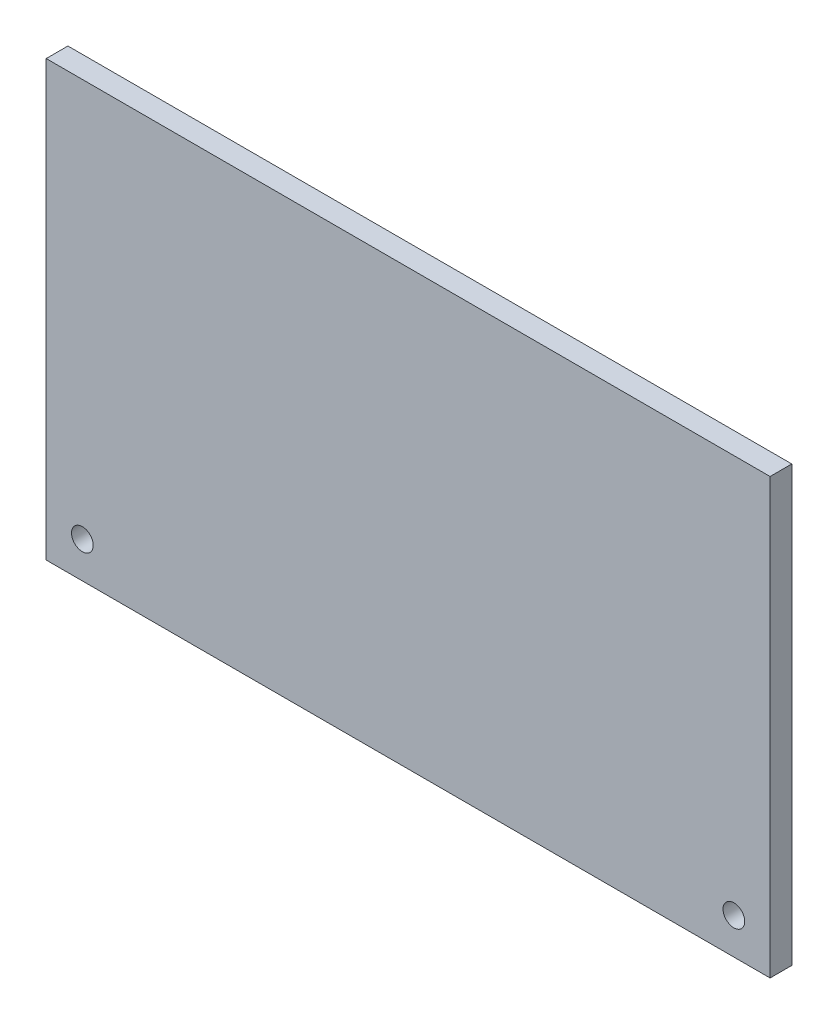
ISO-10303-21;
HEADER;
FILE_DESCRIPTION(('STEP AP214'),'2;1');
FILE_NAME('part.step','',(''),(''),'','','');
FILE_SCHEMA(('AUTOMOTIVE_DESIGN { 1 0 10303 214 1 1 1 1 }'));
ENDSEC;
DATA;
#1=APPLICATION_CONTEXT('core data for automotive mechanical design processes');
#2=APPLICATION_PROTOCOL_DEFINITION('international standard','automotive_design',2000,#1);
#3=PRODUCT_CONTEXT('',#1,'mechanical');
#4=PRODUCT('Part','Part','',(#3));
#5=PRODUCT_RELATED_PRODUCT_CATEGORY('part','',(#4));
#6=PRODUCT_DEFINITION_FORMATION('','',#4);
#7=PRODUCT_DEFINITION_CONTEXT('part definition',#1,'design');
#8=PRODUCT_DEFINITION('design','',#6,#7);
#9=PRODUCT_DEFINITION_SHAPE('','',#8);
#10=(LENGTH_UNIT() NAMED_UNIT(*) SI_UNIT(.MILLI.,.METRE.));
#11=(NAMED_UNIT(*) PLANE_ANGLE_UNIT() SI_UNIT($,.RADIAN.));
#12=(NAMED_UNIT(*) SI_UNIT($,.STERADIAN.) SOLID_ANGLE_UNIT());
#13=UNCERTAINTY_MEASURE_WITH_UNIT(LENGTH_MEASURE(1.E-05),#10,'distance_accuracy_value','');
#14=(GEOMETRIC_REPRESENTATION_CONTEXT(3) GLOBAL_UNCERTAINTY_ASSIGNED_CONTEXT((#13)) GLOBAL_UNIT_ASSIGNED_CONTEXT((#10,
#11,#12)) REPRESENTATION_CONTEXT('',''));
#15=CARTESIAN_POINT('',(0.,0.,0.));
#16=DIRECTION('',(0.,0.,1.));
#17=DIRECTION('',(1.,0.,0.));
#18=AXIS2_PLACEMENT_3D('',#15,#16,#17);
#19=CARTESIAN_POINT('',(-57.4955908289242,34.0388007054674,3.));
#20=DIRECTION('',(1.,0.,0.));
#21=DIRECTION('',(0.,0.,-1.));
#22=AXIS2_PLACEMENT_3D('',#19,#20,#21);
#23=PLANE('',#22);
#24=DIRECTION('',(0.,-1.,0.));
#25=VECTOR('',#24,1.);
#26=CARTESIAN_POINT('',(-57.4955908289242,34.0388007054674,0.));
#27=LINE('',#26,#25);
#28=CARTESIAN_POINT('',(-57.4955908289242,34.0388007054674,0.));
#29=VERTEX_POINT('',#28);
#30=CARTESIAN_POINT('',(-57.4955908289242,-25.9611992945326,0.));
#31=VERTEX_POINT('',#30);
#32=EDGE_CURVE('E110',#29,#31,#27,.T.);
#33=ORIENTED_EDGE('',*,*,#32,.T.);
#34=DIRECTION('',(0.,0.,-1.));
#35=VECTOR('',#34,1.);
#36=CARTESIAN_POINT('',(-57.4955908289242,-25.9611992945326,3.));
#37=LINE('',#36,#35);
#38=CARTESIAN_POINT('',(-57.4955908289242,-25.9611992945326,3.));
#39=VERTEX_POINT('',#38);
#40=EDGE_CURVE('E11',#39,#31,#37,.T.);
#41=ORIENTED_EDGE('',*,*,#40,.F.);
#42=DIRECTION('',(0.,-1.,0.));
#43=VECTOR('',#42,1.);
#44=CARTESIAN_POINT('',(-57.4955908289242,34.0388007054674,3.));
#45=LINE('',#44,#43);
#46=CARTESIAN_POINT('',(-57.4955908289242,34.0388007054674,3.));
#47=VERTEX_POINT('',#46);
#48=EDGE_CURVE('E94',#47,#39,#45,.T.);
#49=ORIENTED_EDGE('',*,*,#48,.F.);
#50=DIRECTION('',(0.,0.,-1.));
#51=VECTOR('',#50,1.);
#52=CARTESIAN_POINT('',(-57.4955908289242,34.0388007054674,3.));
#53=LINE('',#52,#51);
#54=EDGE_CURVE('E106',#47,#29,#53,.T.);
#55=ORIENTED_EDGE('',*,*,#54,.T.);
#56=EDGE_LOOP('',(#33,#41,#49,#55));
#57=FACE_BOUND('',#56,.T.);
#58=ADVANCED_FACE('F42',(#57),#23,.F.);
#59=CARTESIAN_POINT('',(-57.4955908289242,-25.9611992945326,3.));
#60=DIRECTION('',(0.,1.,0.));
#61=DIRECTION('',(0.,0.,1.));
#62=AXIS2_PLACEMENT_3D('',#59,#60,#61);
#63=PLANE('',#62);
#64=DIRECTION('',(1.,0.,0.));
#65=VECTOR('',#64,1.);
#66=CARTESIAN_POINT('',(-57.4955908289242,-25.9611992945326,0.));
#67=LINE('',#66,#65);
#68=CARTESIAN_POINT('',(42.5044091710759,-25.9611992945326,0.));
#69=VERTEX_POINT('',#68);
#70=EDGE_CURVE('E99',#31,#69,#67,.T.);
#71=ORIENTED_EDGE('',*,*,#70,.T.);
#72=DIRECTION('',(0.,0.,-1.));
#73=VECTOR('',#72,1.);
#74=CARTESIAN_POINT('',(42.5044091710759,-25.9611992945326,3.));
#75=LINE('',#74,#73);
#76=CARTESIAN_POINT('',(42.5044091710759,-25.9611992945326,3.));
#77=VERTEX_POINT('',#76);
#78=EDGE_CURVE('E51',#77,#69,#75,.T.);
#79=ORIENTED_EDGE('',*,*,#78,.F.);
#80=DIRECTION('',(1.,0.,0.));
#81=VECTOR('',#80,1.);
#82=CARTESIAN_POINT('',(-57.4955908289242,-25.9611992945326,3.));
#83=LINE('',#82,#81);
#84=EDGE_CURVE('E89',#39,#77,#83,.T.);
#85=ORIENTED_EDGE('',*,*,#84,.F.);
#86=ORIENTED_EDGE('',*,*,#40,.T.);
#87=EDGE_LOOP('',(#71,#79,#85,#86));
#88=FACE_BOUND('',#87,.T.);
#89=ADVANCED_FACE('F98',(#88),#63,.F.);
#90=CARTESIAN_POINT('',(42.5044091710758,34.0388007054674,3.));
#91=DIRECTION('',(-1.,0.,0.));
#92=DIRECTION('',(0.,-1.,0.));
#93=AXIS2_PLACEMENT_3D('',#90,#91,#92);
#94=PLANE('',#93);
#95=DIRECTION('',(0.,1.,0.));
#96=VECTOR('',#95,1.);
#97=CARTESIAN_POINT('',(42.5044091710758,34.0388007054674,0.));
#98=LINE('',#97,#96);
#99=CARTESIAN_POINT('',(42.5044091710758,34.0388007054674,0.));
#100=VERTEX_POINT('',#99);
#101=EDGE_CURVE('E76',#69,#100,#98,.T.);
#102=ORIENTED_EDGE('',*,*,#101,.T.);
#103=DIRECTION('',(0.,0.,-1.));
#104=VECTOR('',#103,1.);
#105=CARTESIAN_POINT('',(42.5044091710758,34.0388007054674,3.));
#106=LINE('',#105,#104);
#107=CARTESIAN_POINT('',(42.5044091710758,34.0388007054674,3.));
#108=VERTEX_POINT('',#107);
#109=EDGE_CURVE('E101',#108,#100,#106,.T.);
#110=ORIENTED_EDGE('',*,*,#109,.F.);
#111=DIRECTION('',(0.,1.,0.));
#112=VECTOR('',#111,1.);
#113=CARTESIAN_POINT('',(42.5044091710758,34.0388007054674,3.));
#114=LINE('',#113,#112);
#115=EDGE_CURVE('E92',#77,#108,#114,.T.);
#116=ORIENTED_EDGE('',*,*,#115,.F.);
#117=ORIENTED_EDGE('',*,*,#78,.T.);
#118=EDGE_LOOP('',(#102,#110,#116,#117));
#119=FACE_BOUND('',#118,.T.);
#120=ADVANCED_FACE('F102',(#119),#94,.F.);
#121=CARTESIAN_POINT('',(-57.4955908289242,34.0388007054674,3.));
#122=DIRECTION('',(0.,-1.,0.));
#123=DIRECTION('',(0.,0.,-1.));
#124=AXIS2_PLACEMENT_3D('',#121,#122,#123);
#125=PLANE('',#124);
#126=DIRECTION('',(-1.,0.,0.));
#127=VECTOR('',#126,1.);
#128=CARTESIAN_POINT('',(-57.4955908289242,34.0388007054674,0.));
#129=LINE('',#128,#127);
#130=EDGE_CURVE('E82',#100,#29,#129,.T.);
#131=ORIENTED_EDGE('',*,*,#130,.T.);
#132=ORIENTED_EDGE('',*,*,#54,.F.);
#133=DIRECTION('',(-1.,0.,0.));
#134=VECTOR('',#133,1.);
#135=CARTESIAN_POINT('',(-57.4955908289242,34.0388007054674,3.));
#136=LINE('',#135,#134);
#137=EDGE_CURVE('E59',#108,#47,#136,.T.);
#138=ORIENTED_EDGE('',*,*,#137,.F.);
#139=ORIENTED_EDGE('',*,*,#109,.T.);
#140=EDGE_LOOP('',(#131,#132,#138,#139));
#141=FACE_BOUND('',#140,.T.);
#142=ADVANCED_FACE('F124',(#141),#125,.F.);
#143=CARTESIAN_POINT('',(0.,0.,3.));
#144=DIRECTION('',(0.,0.,1.));
#145=DIRECTION('',(1.,0.,0.));
#146=AXIS2_PLACEMENT_3D('',#143,#144,#145);
#147=PLANE('',#146);
#148=CARTESIAN_POINT('',(37.5044091710758,-20.9611992945327,3.));
#149=DIRECTION('',(0.,0.,1.));
#150=DIRECTION('',(1.,0.,0.));
#151=AXIS2_PLACEMENT_3D('',#148,#149,#150);
#152=CIRCLE('',#151,1.5);
#153=CARTESIAN_POINT('',(39.0044091710758,-20.9611992945327,3.));
#154=VERTEX_POINT('',#153);
#155=EDGE_CURVE('E139',#154,#154,#152,.T.);
#156=ORIENTED_EDGE('',*,*,#155,.F.);
#157=EDGE_LOOP('',(#156));
#158=FACE_BOUND('',#157,.T.);
#159=CARTESIAN_POINT('',(-52.5000254187247,-20.9611992945327,3.));
#160=DIRECTION('',(0.,0.,1.));
#161=DIRECTION('',(1.,0.,0.));
#162=AXIS2_PLACEMENT_3D('',#159,#160,#161);
#163=CIRCLE('',#162,1.5);
#164=CARTESIAN_POINT('',(-51.0000254187247,-20.9611992945327,3.));
#165=VERTEX_POINT('',#164);
#166=EDGE_CURVE('E135',#165,#165,#163,.T.);
#167=ORIENTED_EDGE('',*,*,#166,.F.);
#168=EDGE_LOOP('',(#167));
#169=FACE_BOUND('',#168,.T.);
#170=ORIENTED_EDGE('',*,*,#48,.T.);
#171=ORIENTED_EDGE('',*,*,#84,.T.);
#172=ORIENTED_EDGE('',*,*,#115,.T.);
#173=ORIENTED_EDGE('',*,*,#137,.T.);
#174=EDGE_LOOP('',(#170,#171,#172,#173));
#175=FACE_BOUND('',#174,.T.);
#176=ADVANCED_FACE('F90',(#158,#169,#175),#147,.T.);
#177=CARTESIAN_POINT('',(0.,0.,0.));
#178=DIRECTION('',(0.,0.,1.));
#179=DIRECTION('',(1.,0.,0.));
#180=AXIS2_PLACEMENT_3D('',#177,#178,#179);
#181=PLANE('',#180);
#182=CARTESIAN_POINT('',(37.5044091710758,-20.9611992945327,0.));
#183=DIRECTION('',(0.,0.,1.));
#184=DIRECTION('',(1.,0.,0.));
#185=AXIS2_PLACEMENT_3D('',#182,#183,#184);
#186=CIRCLE('',#185,1.5);
#187=CARTESIAN_POINT('',(39.0044091710758,-20.9611992945327,0.));
#188=VERTEX_POINT('',#187);
#189=EDGE_CURVE('E114',#188,#188,#186,.T.);
#190=ORIENTED_EDGE('',*,*,#189,.T.);
#191=EDGE_LOOP('',(#190));
#192=FACE_BOUND('',#191,.T.);
#193=CARTESIAN_POINT('',(-52.5000254187247,-20.9611992945327,0.));
#194=DIRECTION('',(0.,0.,1.));
#195=DIRECTION('',(1.,0.,0.));
#196=AXIS2_PLACEMENT_3D('',#193,#194,#195);
#197=CIRCLE('',#196,1.5);
#198=CARTESIAN_POINT('',(-51.0000254187247,-20.9611992945327,0.));
#199=VERTEX_POINT('',#198);
#200=EDGE_CURVE('E131',#199,#199,#197,.T.);
#201=ORIENTED_EDGE('',*,*,#200,.T.);
#202=EDGE_LOOP('',(#201));
#203=FACE_BOUND('',#202,.T.);
#204=ORIENTED_EDGE('',*,*,#32,.F.);
#205=ORIENTED_EDGE('',*,*,#130,.F.);
#206=ORIENTED_EDGE('',*,*,#101,.F.);
#207=ORIENTED_EDGE('',*,*,#70,.F.);
#208=EDGE_LOOP('',(#204,#205,#206,#207));
#209=FACE_BOUND('',#208,.T.);
#210=ADVANCED_FACE('F127',(#192,#203,#209),#181,.F.);
#211=CARTESIAN_POINT('',(-52.5000254187247,-20.9611992945327,0.));
#212=DIRECTION('',(0.,0.,1.));
#213=DIRECTION('',(1.,0.,0.));
#214=AXIS2_PLACEMENT_3D('',#211,#212,#213);
#215=CYLINDRICAL_SURFACE('',#214,1.5);
#216=ORIENTED_EDGE('',*,*,#200,.F.);
#217=EDGE_LOOP('',(#216));
#218=FACE_BOUND('',#217,.T.);
#219=ORIENTED_EDGE('',*,*,#166,.T.);
#220=EDGE_LOOP('',(#219));
#221=FACE_BOUND('',#220,.T.);
#222=ADVANCED_FACE('F152',(#218,#221),#215,.F.);
#223=CARTESIAN_POINT('',(37.5044091710758,-20.9611992945327,0.));
#224=DIRECTION('',(0.,0.,1.));
#225=DIRECTION('',(1.,0.,0.));
#226=AXIS2_PLACEMENT_3D('',#223,#224,#225);
#227=CYLINDRICAL_SURFACE('',#226,1.5);
#228=ORIENTED_EDGE('',*,*,#189,.F.);
#229=EDGE_LOOP('',(#228));
#230=FACE_BOUND('',#229,.T.);
#231=ORIENTED_EDGE('',*,*,#155,.T.);
#232=EDGE_LOOP('',(#231));
#233=FACE_BOUND('',#232,.T.);
#234=ADVANCED_FACE('F149',(#230,#233),#227,.F.);
#235=CLOSED_SHELL('',(#58,#89,#120,#142,#176,#210,#222,#234));
#236=MANIFOLD_SOLID_BREP('B2',#235);
#237=ADVANCED_BREP_SHAPE_REPRESENTATION('',(#18,#236),#14);
#238=SHAPE_DEFINITION_REPRESENTATION(#9,#237);
ENDSEC;
END-ISO-10303-21;
